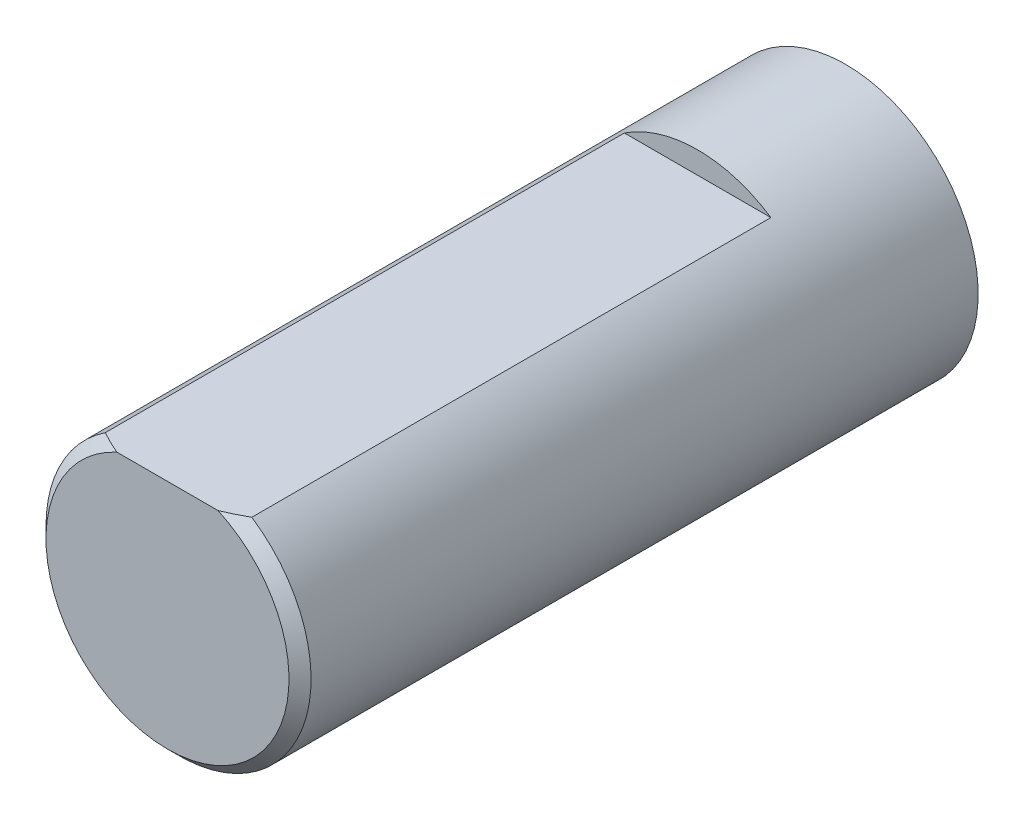
ISO-10303-21;
HEADER;
FILE_DESCRIPTION(('STEP AP214'),'2;1');
FILE_NAME('part.step','',(''),(''),'','','');
FILE_SCHEMA(('AUTOMOTIVE_DESIGN { 1 0 10303 214 1 1 1 1 }'));
ENDSEC;
DATA;
#1=APPLICATION_CONTEXT('core data for automotive mechanical design processes');
#2=APPLICATION_PROTOCOL_DEFINITION('international standard','automotive_design',2000,#1);
#3=PRODUCT_CONTEXT('',#1,'mechanical');
#4=PRODUCT('Part','Part','',(#3));
#5=PRODUCT_RELATED_PRODUCT_CATEGORY('part','',(#4));
#6=PRODUCT_DEFINITION_FORMATION('','',#4);
#7=PRODUCT_DEFINITION_CONTEXT('part definition',#1,'design');
#8=PRODUCT_DEFINITION('design','',#6,#7);
#9=PRODUCT_DEFINITION_SHAPE('','',#8);
#10=(LENGTH_UNIT() NAMED_UNIT(*) SI_UNIT(.MILLI.,.METRE.));
#11=(NAMED_UNIT(*) PLANE_ANGLE_UNIT() SI_UNIT($,.RADIAN.));
#12=(NAMED_UNIT(*) SI_UNIT($,.STERADIAN.) SOLID_ANGLE_UNIT());
#13=UNCERTAINTY_MEASURE_WITH_UNIT(LENGTH_MEASURE(1.E-05),#10,'distance_accuracy_value','');
#14=(GEOMETRIC_REPRESENTATION_CONTEXT(3) GLOBAL_UNCERTAINTY_ASSIGNED_CONTEXT((#13)) GLOBAL_UNIT_ASSIGNED_CONTEXT((#10,
#11,#12)) REPRESENTATION_CONTEXT('',''));
#15=CARTESIAN_POINT('',(0.,0.,0.));
#16=DIRECTION('',(0.,0.,1.));
#17=DIRECTION('',(1.,0.,0.));
#18=AXIS2_PLACEMENT_3D('',#15,#16,#17);
#19=CARTESIAN_POINT('',(3.05,-18.51,5.65));
#20=DIRECTION('',(0.,0.,-1.));
#21=DIRECTION('',(-1.,0.,0.));
#22=AXIS2_PLACEMENT_3D('',#19,#20,#21);
#23=PLANE('',#22);
#24=CARTESIAN_POINT('',(0.,7.,5.65));
#25=DIRECTION('',(0.,0.,-1.));
#26=DIRECTION('',(-1.,0.,0.));
#27=AXIS2_PLACEMENT_3D('',#24,#25,#26);
#28=CIRCLE('',#27,3.);
#29=CARTESIAN_POINT('',(-3.,7.,5.65));
#30=VERTEX_POINT('',#29);
#31=EDGE_CURVE('E57',#30,#30,#28,.F.);
#32=ORIENTED_EDGE('',*,*,#31,.F.);
#33=EDGE_LOOP('',(#32));
#34=FACE_BOUND('',#33,.T.);
#35=ADVANCED_FACE('F53',(#34),#23,.T.);
#36=CARTESIAN_POINT('',(0.,7.,21.));
#37=DIRECTION('',(0.,0.,1.));
#38=DIRECTION('',(1.,0.,0.));
#39=AXIS2_PLACEMENT_3D('',#36,#37,#38);
#40=PLANE('',#39);
#41=DIRECTION('',(1.,0.,0.));
#42=VECTOR('',#41,1.);
#43=CARTESIAN_POINT('',(-1.6583123951777,9.5,21.));
#44=LINE('',#43,#42);
#45=CARTESIAN_POINT('',(-1.14564392373899,9.5,21.));
#46=VERTEX_POINT('',#45);
#47=CARTESIAN_POINT('',(1.14564392373899,9.5,21.));
#48=VERTEX_POINT('',#47);
#49=EDGE_CURVE('E78',#46,#48,#44,.T.);
#50=ORIENTED_EDGE('',*,*,#49,.F.);
#51=CARTESIAN_POINT('',(0.,7.,21.));
#52=DIRECTION('',(0.,0.,1.));
#53=DIRECTION('',(1.,0.,0.));
#54=AXIS2_PLACEMENT_3D('',#51,#52,#53);
#55=CIRCLE('',#54,2.75);
#56=EDGE_CURVE('E11',#46,#48,#55,.T.);
#57=ORIENTED_EDGE('',*,*,#56,.T.);
#58=EDGE_LOOP('',(#50,#57));
#59=FACE_BOUND('',#58,.T.);
#60=ADVANCED_FACE('F148',(#59),#40,.T.);
#61=CARTESIAN_POINT('',(0.,7.,9.));
#62=DIRECTION('',(0.,0.,1.));
#63=DIRECTION('',(1.,0.,0.));
#64=AXIS2_PLACEMENT_3D('',#61,#62,#63);
#65=PLANE('',#64);
#66=CARTESIAN_POINT('',(0.,7.,9.));
#67=DIRECTION('',(0.,0.,1.));
#68=DIRECTION('',(1.,0.,0.));
#69=AXIS2_PLACEMENT_3D('',#66,#67,#68);
#70=CIRCLE('',#69,3.);
#71=CARTESIAN_POINT('',(1.6583123951777,9.5,9.));
#72=VERTEX_POINT('',#71);
#73=CARTESIAN_POINT('',(-1.6583123951777,9.5,9.));
#74=VERTEX_POINT('',#73);
#75=EDGE_CURVE('E106',#72,#74,#70,.T.);
#76=ORIENTED_EDGE('',*,*,#75,.T.);
#77=DIRECTION('',(1.,0.,0.));
#78=VECTOR('',#77,1.);
#79=CARTESIAN_POINT('',(-1.6583123951777,9.5,9.));
#80=LINE('',#79,#78);
#81=EDGE_CURVE('E99',#74,#72,#80,.T.);
#82=ORIENTED_EDGE('',*,*,#81,.T.);
#83=EDGE_LOOP('',(#76,#82));
#84=FACE_BOUND('',#83,.T.);
#85=ADVANCED_FACE('F104',(#84),#65,.T.);
#86=CARTESIAN_POINT('',(-1.6583123951777,9.5,9.));
#87=DIRECTION('',(0.,-1.,0.));
#88=DIRECTION('',(0.,0.,-1.));
#89=AXIS2_PLACEMENT_3D('',#86,#87,#88);
#90=PLANE('',#89);
#91=ORIENTED_EDGE('',*,*,#49,.T.);
#92=CARTESIAN_POINT('',(1.14564392373902,9.5,21.));
#93=CARTESIAN_POINT('',(1.18956321617488,9.5,20.9817011580274));
#94=CARTESIAN_POINT('',(1.23317079639276,9.5,20.9626669606732));
#95=CARTESIAN_POINT('',(1.31975438176407,9.5,20.9232946582386));
#96=CARTESIAN_POINT('',(1.3627308390396,9.5,20.9029575487891));
#97=CARTESIAN_POINT('',(1.44810578748744,9.5,20.861120333448));
#98=CARTESIAN_POINT('',(1.49050433918452,9.5,20.8396203505357));
#99=CARTESIAN_POINT('',(1.57479149276022,9.5,20.7955660533739));
#100=CARTESIAN_POINT('',(1.61667968515748,9.5,20.773010954824));
#101=CARTESIAN_POINT('',(1.6583123951777,9.5,20.75));
#102=B_SPLINE_CURVE_WITH_KNOTS('',3,(#92,#93,#94,#95,#96,#97,#98,#99,#100,#101),.UNSPECIFIED.,
.F.,.F.,(4,2,2,2,4),(0.,0.142722943356305,0.285338095483277,0.427938194768087,
0.570646031905079),.UNSPECIFIED.);
#103=CARTESIAN_POINT('',(1.6583123951777,9.5,20.75));
#104=VERTEX_POINT('',#103);
#105=EDGE_CURVE('E113',#48,#104,#102,.T.);
#106=ORIENTED_EDGE('',*,*,#105,.T.);
#107=DIRECTION('',(0.,0.,1.));
#108=VECTOR('',#107,1.);
#109=CARTESIAN_POINT('',(1.6583123951777,9.5,9.));
#110=LINE('',#109,#108);
#111=EDGE_CURVE('E111',#72,#104,#110,.T.);
#112=ORIENTED_EDGE('',*,*,#111,.F.);
#113=ORIENTED_EDGE('',*,*,#81,.F.);
#114=DIRECTION('',(0.,0.,1.));
#115=VECTOR('',#114,1.);
#116=CARTESIAN_POINT('',(-1.6583123951777,9.5,9.));
#117=LINE('',#116,#115);
#118=CARTESIAN_POINT('',(-1.6583123951777,9.5,20.75));
#119=VERTEX_POINT('',#118);
#120=EDGE_CURVE('E119',#74,#119,#117,.T.);
#121=ORIENTED_EDGE('',*,*,#120,.T.);
#122=CARTESIAN_POINT('',(-1.6583123951777,9.5,20.75));
#123=CARTESIAN_POINT('',(-1.61667968515749,9.5,20.773010954824));
#124=CARTESIAN_POINT('',(-1.57479149276022,9.5,20.7955660533739));
#125=CARTESIAN_POINT('',(-1.49050433918452,9.5,20.8396203505357));
#126=CARTESIAN_POINT('',(-1.44810578748744,9.5,20.8611203334479));
#127=CARTESIAN_POINT('',(-1.3627308390396,9.5,20.9029575487891));
#128=CARTESIAN_POINT('',(-1.31975438176407,9.5,20.9232946582386));
#129=CARTESIAN_POINT('',(-1.23317079639277,9.5,20.9626669606732));
#130=CARTESIAN_POINT('',(-1.18956321617489,9.5,20.9817011580274));
#131=CARTESIAN_POINT('',(-1.14564392373902,9.5,21.));
#132=B_SPLINE_CURVE_WITH_KNOTS('',3,(#122,#123,#124,#125,#126,#127,#128,#129,#130,#131),
.UNSPECIFIED.,.F.,.F.,(4,2,2,2,4),(0.,0.142707837136991,0.285307936421801,0.427923088548772,
0.570646031905079),.UNSPECIFIED.);
#133=EDGE_CURVE('E109',#119,#46,#132,.T.);
#134=ORIENTED_EDGE('',*,*,#133,.T.);
#135=EDGE_LOOP('',(#91,#106,#112,#113,#121,#134));
#136=FACE_BOUND('',#135,.T.);
#137=ADVANCED_FACE('F112',(#136),#90,.F.);
#138=CARTESIAN_POINT('',(0.,7.,21.));
#139=DIRECTION('',(0.,0.,-1.));
#140=DIRECTION('',(-1.,0.,0.));
#141=AXIS2_PLACEMENT_3D('',#138,#139,#140);
#142=CONICAL_SURFACE('',#141,2.75,0.785398163397459);
#143=ORIENTED_EDGE('',*,*,#56,.F.);
#144=ORIENTED_EDGE('',*,*,#133,.F.);
#145=CARTESIAN_POINT('',(0.,7.,20.75));
#146=DIRECTION('',(0.,0.,-1.));
#147=DIRECTION('',(1.,0.,0.));
#148=AXIS2_PLACEMENT_3D('',#145,#146,#147);
#149=CIRCLE('',#148,3.);
#150=EDGE_CURVE('E64',#104,#119,#149,.T.);
#151=ORIENTED_EDGE('',*,*,#150,.F.);
#152=ORIENTED_EDGE('',*,*,#105,.F.);
#153=EDGE_LOOP('',(#143,#144,#151,#152));
#154=FACE_BOUND('',#153,.T.);
#155=ADVANCED_FACE('F141',(#154),#142,.T.);
#156=CARTESIAN_POINT('',(0.,7.,21.));
#157=DIRECTION('',(0.,0.,-1.));
#158=DIRECTION('',(-1.,0.,0.));
#159=AXIS2_PLACEMENT_3D('',#156,#157,#158);
#160=CYLINDRICAL_SURFACE('',#159,3.);
#161=ORIENTED_EDGE('',*,*,#150,.T.);
#162=ORIENTED_EDGE('',*,*,#120,.F.);
#163=ORIENTED_EDGE('',*,*,#75,.F.);
#164=ORIENTED_EDGE('',*,*,#111,.T.);
#165=EDGE_LOOP('',(#161,#162,#163,#164));
#166=FACE_BOUND('',#165,.T.);
#167=ORIENTED_EDGE('',*,*,#31,.T.);
#168=EDGE_LOOP('',(#167));
#169=FACE_BOUND('',#168,.T.);
#170=ADVANCED_FACE('F55',(#166,#169),#160,.T.);
#171=CLOSED_SHELL('',(#35,#60,#85,#137,#155,#170));
#172=MANIFOLD_SOLID_BREP('B2',#171);
#173=ADVANCED_BREP_SHAPE_REPRESENTATION('',(#18,#172),#14);
#174=SHAPE_DEFINITION_REPRESENTATION(#9,#173);
ENDSEC;
END-ISO-10303-21;
